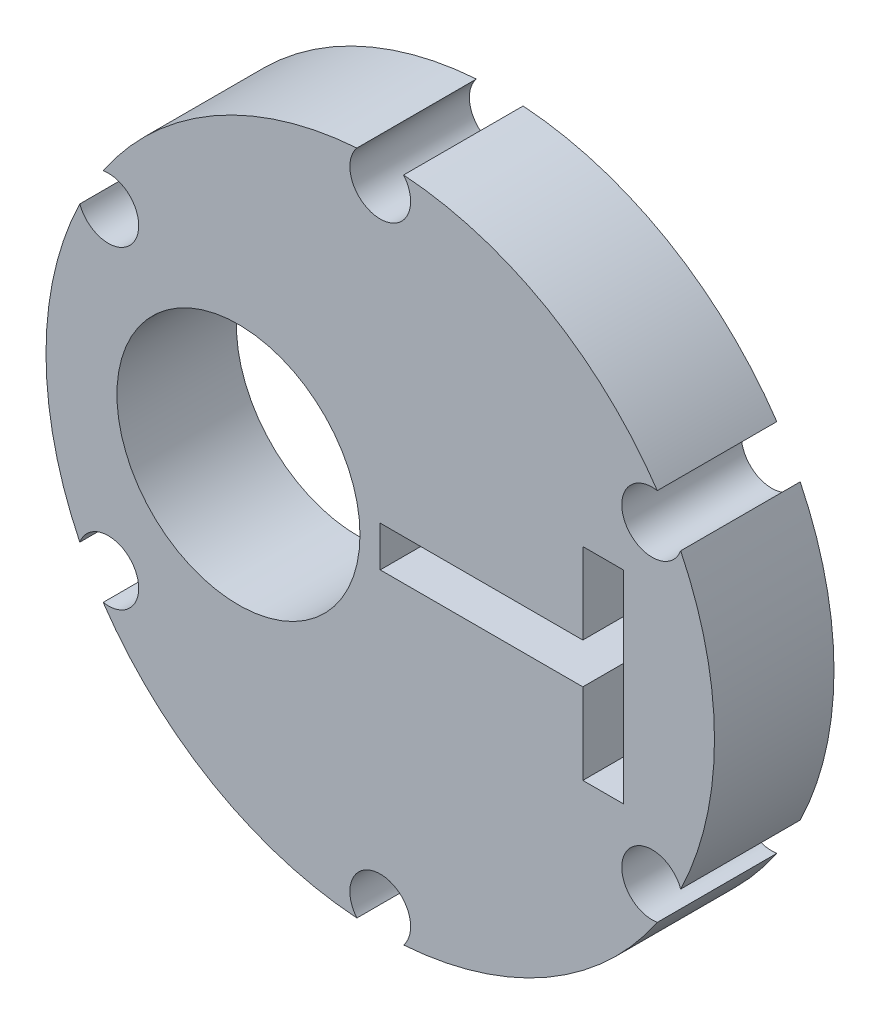
ISO-10303-21;
HEADER;
FILE_DESCRIPTION(('STEP AP214'),'2;1');
FILE_NAME('part.step','',(''),(''),'','','');
FILE_SCHEMA(('AUTOMOTIVE_DESIGN { 1 0 10303 214 1 1 1 1 }'));
ENDSEC;
DATA;
#1=APPLICATION_CONTEXT('core data for automotive mechanical design processes');
#2=APPLICATION_PROTOCOL_DEFINITION('international standard','automotive_design',2000,#1);
#3=PRODUCT_CONTEXT('',#1,'mechanical');
#4=PRODUCT('Part','Part','',(#3));
#5=PRODUCT_RELATED_PRODUCT_CATEGORY('part','',(#4));
#6=PRODUCT_DEFINITION_FORMATION('','',#4);
#7=PRODUCT_DEFINITION_CONTEXT('part definition',#1,'design');
#8=PRODUCT_DEFINITION('design','',#6,#7);
#9=PRODUCT_DEFINITION_SHAPE('','',#8);
#10=(LENGTH_UNIT() NAMED_UNIT(*) SI_UNIT(.MILLI.,.METRE.));
#11=(NAMED_UNIT(*) PLANE_ANGLE_UNIT() SI_UNIT($,.RADIAN.));
#12=(NAMED_UNIT(*) SI_UNIT($,.STERADIAN.) SOLID_ANGLE_UNIT());
#13=UNCERTAINTY_MEASURE_WITH_UNIT(LENGTH_MEASURE(1.E-05),#10,'distance_accuracy_value','');
#14=(GEOMETRIC_REPRESENTATION_CONTEXT(3) GLOBAL_UNCERTAINTY_ASSIGNED_CONTEXT((#13)) GLOBAL_UNIT_ASSIGNED_CONTEXT((#10,
#11,#12)) REPRESENTATION_CONTEXT('',''));
#15=CARTESIAN_POINT('',(0.,0.,0.));
#16=DIRECTION('',(0.,0.,1.));
#17=DIRECTION('',(1.,0.,0.));
#18=AXIS2_PLACEMENT_3D('',#15,#16,#17);
#19=CARTESIAN_POINT('',(0.,0.,5.9));
#20=DIRECTION('',(0.,0.,-1.));
#21=DIRECTION('',(-1.,0.,0.));
#22=AXIS2_PLACEMENT_3D('',#19,#20,#21);
#23=CYLINDRICAL_SURFACE('',#22,16.5);
#24=CARTESIAN_POINT('',(0.,0.,0.));
#25=DIRECTION('',(0.,0.,1.));
#26=DIRECTION('',(1.,0.,0.));
#27=AXIS2_PLACEMENT_3D('',#24,#25,#26);
#28=CIRCLE('',#27,16.5);
#29=CARTESIAN_POINT('',(14.8309142694271,-7.23145780136368,0.));
#30=VERTEX_POINT('',#29);
#31=CARTESIAN_POINT('',(14.8309142694271,7.23145780136372,0.));
#32=VERTEX_POINT('',#31);
#33=EDGE_CURVE('E329',#30,#32,#28,.T.);
#34=ORIENTED_EDGE('',*,*,#33,.T.);
#35=DIRECTION('',(0.,0.,1.));
#36=VECTOR('',#35,1.);
#37=CARTESIAN_POINT('',(14.8309142694271,7.23145780136372,2.95));
#38=LINE('',#37,#36);
#39=CARTESIAN_POINT('',(14.8309142694271,7.23145780136372,5.9));
#40=VERTEX_POINT('',#39);
#41=EDGE_CURVE('E286',#32,#40,#38,.T.);
#42=ORIENTED_EDGE('',*,*,#41,.T.);
#43=CARTESIAN_POINT('',(0.,0.,5.9));
#44=DIRECTION('',(0.,0.,1.));
#45=DIRECTION('',(1.,0.,0.));
#46=AXIS2_PLACEMENT_3D('',#43,#44,#45);
#47=CIRCLE('',#46,16.5);
#48=CARTESIAN_POINT('',(14.8309142694271,-7.23145780136368,5.9));
#49=VERTEX_POINT('',#48);
#50=EDGE_CURVE('E350',#49,#40,#47,.T.);
#51=ORIENTED_EDGE('',*,*,#50,.F.);
#52=DIRECTION('',(0.,0.,1.));
#53=VECTOR('',#52,1.);
#54=CARTESIAN_POINT('',(14.8309142694271,-7.23145780136368,2.95));
#55=LINE('',#54,#53);
#56=EDGE_CURVE('E277',#49,#30,#55,.F.);
#57=ORIENTED_EDGE('',*,*,#56,.T.);
#58=EDGE_LOOP('',(#34,#42,#51,#57));
#59=FACE_BOUND('',#58,.T.);
#60=ADVANCED_FACE('F32',(#59),#23,.T.);
#61=CARTESIAN_POINT('',(1.15283097233743,-16.4596774193548,0.));
#62=VERTEX_POINT('',#61);
#63=CARTESIAN_POINT('',(13.6780832970897,-9.22821961799116,0.));
#64=VERTEX_POINT('',#63);
#65=EDGE_CURVE('E326',#62,#64,#28,.T.);
#66=ORIENTED_EDGE('',*,*,#65,.T.);
#67=DIRECTION('',(0.,0.,1.));
#68=VECTOR('',#67,1.);
#69=CARTESIAN_POINT('',(13.6780832970897,-9.22821961799114,2.95));
#70=LINE('',#69,#68);
#71=CARTESIAN_POINT('',(13.6780832970897,-9.22821961799114,5.9));
#72=VERTEX_POINT('',#71);
#73=EDGE_CURVE('E280',#64,#72,#70,.T.);
#74=ORIENTED_EDGE('',*,*,#73,.T.);
#75=CARTESIAN_POINT('',(1.15283097233743,-16.4596774193548,5.9));
#76=VERTEX_POINT('',#75);
#77=EDGE_CURVE('E351',#76,#72,#47,.T.);
#78=ORIENTED_EDGE('',*,*,#77,.F.);
#79=DIRECTION('',(0.,0.,1.));
#80=VECTOR('',#79,1.);
#81=CARTESIAN_POINT('',(1.15283097233743,-16.4596774193548,2.95));
#82=LINE('',#81,#80);
#83=EDGE_CURVE('E271',#76,#62,#82,.F.);
#84=ORIENTED_EDGE('',*,*,#83,.T.);
#85=EDGE_LOOP('',(#66,#74,#78,#84));
#86=FACE_BOUND('',#85,.T.);
#87=ADVANCED_FACE('F374',(#86),#23,.T.);
#88=CARTESIAN_POINT('',(-13.6780832970896,-9.22821961799115,0.));
#89=VERTEX_POINT('',#88);
#90=CARTESIAN_POINT('',(-1.15283097233744,-16.4596774193548,0.));
#91=VERTEX_POINT('',#90);
#92=EDGE_CURVE('E320',#89,#91,#28,.T.);
#93=ORIENTED_EDGE('',*,*,#92,.T.);
#94=DIRECTION('',(0.,0.,1.));
#95=VECTOR('',#94,1.);
#96=CARTESIAN_POINT('',(-1.15283097233743,-16.4596774193548,2.95));
#97=LINE('',#96,#95);
#98=CARTESIAN_POINT('',(-1.15283097233743,-16.4596774193548,5.9));
#99=VERTEX_POINT('',#98);
#100=EDGE_CURVE('E274',#91,#99,#97,.T.);
#101=ORIENTED_EDGE('',*,*,#100,.T.);
#102=CARTESIAN_POINT('',(-13.6780832970896,-9.22821961799115,5.9));
#103=VERTEX_POINT('',#102);
#104=EDGE_CURVE('E355',#103,#99,#47,.T.);
#105=ORIENTED_EDGE('',*,*,#104,.F.);
#106=DIRECTION('',(0.,0.,1.));
#107=VECTOR('',#106,1.);
#108=CARTESIAN_POINT('',(-13.6780832970896,-9.22821961799115,2.95));
#109=LINE('',#108,#107);
#110=EDGE_CURVE('E265',#103,#89,#109,.F.);
#111=ORIENTED_EDGE('',*,*,#110,.T.);
#112=EDGE_LOOP('',(#93,#101,#105,#111));
#113=FACE_BOUND('',#112,.T.);
#114=ADVANCED_FACE('F378',(#113),#23,.T.);
#115=CARTESIAN_POINT('',(-14.8309142694271,7.23145780136367,0.));
#116=VERTEX_POINT('',#115);
#117=CARTESIAN_POINT('',(-14.8309142694271,-7.23145780136368,0.));
#118=VERTEX_POINT('',#117);
#119=EDGE_CURVE('E308',#116,#118,#28,.T.);
#120=ORIENTED_EDGE('',*,*,#119,.T.);
#121=DIRECTION('',(0.,0.,1.));
#122=VECTOR('',#121,1.);
#123=CARTESIAN_POINT('',(-14.8309142694271,-7.23145780136369,2.95));
#124=LINE('',#123,#122);
#125=CARTESIAN_POINT('',(-14.8309142694271,-7.23145780136369,5.9));
#126=VERTEX_POINT('',#125);
#127=EDGE_CURVE('E268',#118,#126,#124,.T.);
#128=ORIENTED_EDGE('',*,*,#127,.T.);
#129=CARTESIAN_POINT('',(-14.8309142694271,7.23145780136367,5.9));
#130=VERTEX_POINT('',#129);
#131=EDGE_CURVE('E303',#130,#126,#47,.T.);
#132=ORIENTED_EDGE('',*,*,#131,.F.);
#133=DIRECTION('',(0.,0.,1.));
#134=VECTOR('',#133,1.);
#135=CARTESIAN_POINT('',(-14.8309142694271,7.23145780136367,2.95));
#136=LINE('',#135,#134);
#137=EDGE_CURVE('E247',#130,#116,#136,.F.);
#138=ORIENTED_EDGE('',*,*,#137,.T.);
#139=EDGE_LOOP('',(#120,#128,#132,#138));
#140=FACE_BOUND('',#139,.T.);
#141=ADVANCED_FACE('F323',(#140),#23,.T.);
#142=CARTESIAN_POINT('',(-1.15283097233743,16.4596774193548,0.));
#143=VERTEX_POINT('',#142);
#144=CARTESIAN_POINT('',(-13.6780832970897,9.22821961799115,0.));
#145=VERTEX_POINT('',#144);
#146=EDGE_CURVE('E305',#143,#145,#28,.T.);
#147=ORIENTED_EDGE('',*,*,#146,.T.);
#148=DIRECTION('',(0.,0.,1.));
#149=VECTOR('',#148,1.);
#150=CARTESIAN_POINT('',(-13.6780832970897,9.22821961799113,2.95));
#151=LINE('',#150,#149);
#152=CARTESIAN_POINT('',(-13.6780832970897,9.22821961799113,5.9));
#153=VERTEX_POINT('',#152);
#154=EDGE_CURVE('E262',#145,#153,#151,.T.);
#155=ORIENTED_EDGE('',*,*,#154,.T.);
#156=CARTESIAN_POINT('',(-1.15283097233743,16.4596774193548,5.9));
#157=VERTEX_POINT('',#156);
#158=EDGE_CURVE('E299',#157,#153,#47,.T.);
#159=ORIENTED_EDGE('',*,*,#158,.F.);
#160=DIRECTION('',(0.,0.,1.));
#161=VECTOR('',#160,1.);
#162=CARTESIAN_POINT('',(-1.15283097233743,16.4596774193548,2.95));
#163=LINE('',#162,#161);
#164=EDGE_CURVE('E292',#157,#143,#163,.F.);
#165=ORIENTED_EDGE('',*,*,#164,.T.);
#166=EDGE_LOOP('',(#147,#155,#159,#165));
#167=FACE_BOUND('',#166,.T.);
#168=ADVANCED_FACE('F343',(#167),#23,.T.);
#169=CARTESIAN_POINT('',(13.6780832970897,9.22821961799114,5.9));
#170=VERTEX_POINT('',#169);
#171=CARTESIAN_POINT('',(1.15283097233743,16.4596774193548,5.9));
#172=VERTEX_POINT('',#171);
#173=EDGE_CURVE('E304',#170,#172,#47,.T.);
#174=ORIENTED_EDGE('',*,*,#173,.F.);
#175=DIRECTION('',(0.,0.,1.));
#176=VECTOR('',#175,1.);
#177=CARTESIAN_POINT('',(13.6780832970897,9.22821961799114,2.95));
#178=LINE('',#177,#176);
#179=CARTESIAN_POINT('',(13.6780832970897,9.22821961799114,0.));
#180=VERTEX_POINT('',#179);
#181=EDGE_CURVE('E283',#170,#180,#178,.F.);
#182=ORIENTED_EDGE('',*,*,#181,.T.);
#183=CARTESIAN_POINT('',(1.15283097233744,16.4596774193548,0.));
#184=VERTEX_POINT('',#183);
#185=EDGE_CURVE('E298',#180,#184,#28,.T.);
#186=ORIENTED_EDGE('',*,*,#185,.T.);
#187=DIRECTION('',(0.,0.,1.));
#188=VECTOR('',#187,1.);
#189=CARTESIAN_POINT('',(1.15283097233743,16.4596774193548,2.95));
#190=LINE('',#189,#188);
#191=EDGE_CURVE('E295',#184,#172,#190,.T.);
#192=ORIENTED_EDGE('',*,*,#191,.T.);
#193=EDGE_LOOP('',(#174,#182,#186,#192));
#194=FACE_BOUND('',#193,.T.);
#195=ADVANCED_FACE('F34',(#194),#23,.T.);
#196=CARTESIAN_POINT('',(0.,0.,5.9));
#197=DIRECTION('',(0.,0.,1.));
#198=DIRECTION('',(1.,0.,0.));
#199=AXIS2_PLACEMENT_3D('',#196,#197,#198);
#200=PLANE('',#199);
#201=DIRECTION('',(0.,1.,0.));
#202=VECTOR('',#201,1.);
#203=CARTESIAN_POINT('',(12.,5.,5.9));
#204=LINE('',#203,#202);
#205=CARTESIAN_POINT('',(12.,-5.,5.9));
#206=VERTEX_POINT('',#205);
#207=CARTESIAN_POINT('',(12.,5.,5.9));
#208=VERTEX_POINT('',#207);
#209=EDGE_CURVE('E47',#206,#208,#204,.T.);
#210=ORIENTED_EDGE('',*,*,#209,.F.);
#211=DIRECTION('',(1.,0.,0.));
#212=VECTOR('',#211,1.);
#213=CARTESIAN_POINT('',(12.,-5.,5.9));
#214=LINE('',#213,#212);
#215=CARTESIAN_POINT('',(10.,-5.,5.9));
#216=VERTEX_POINT('',#215);
#217=EDGE_CURVE('E188',#216,#206,#214,.T.);
#218=ORIENTED_EDGE('',*,*,#217,.F.);
#219=DIRECTION('',(0.,-1.,0.));
#220=VECTOR('',#219,1.);
#221=CARTESIAN_POINT('',(10.,-0.999999999999998,5.9));
#222=LINE('',#221,#220);
#223=CARTESIAN_POINT('',(10.,-0.999999999999998,5.9));
#224=VERTEX_POINT('',#223);
#225=EDGE_CURVE('E191',#224,#216,#222,.T.);
#226=ORIENTED_EDGE('',*,*,#225,.F.);
#227=DIRECTION('',(1.,0.,0.));
#228=VECTOR('',#227,1.);
#229=CARTESIAN_POINT('',(0.,-0.999999999999998,5.9));
#230=LINE('',#229,#228);
#231=CARTESIAN_POINT('',(0.,-0.999999999999998,5.9));
#232=VERTEX_POINT('',#231);
#233=EDGE_CURVE('E219',#232,#224,#230,.T.);
#234=ORIENTED_EDGE('',*,*,#233,.F.);
#235=DIRECTION('',(0.,-1.,0.));
#236=VECTOR('',#235,1.);
#237=CARTESIAN_POINT('',(0.,0.999999999999998,5.9));
#238=LINE('',#237,#236);
#239=CARTESIAN_POINT('',(0.,0.999999999999998,5.9));
#240=VERTEX_POINT('',#239);
#241=EDGE_CURVE('E216',#240,#232,#238,.T.);
#242=ORIENTED_EDGE('',*,*,#241,.F.);
#243=DIRECTION('',(-1.,0.,0.));
#244=VECTOR('',#243,1.);
#245=CARTESIAN_POINT('',(0.,0.999999999999998,5.9));
#246=LINE('',#245,#244);
#247=CARTESIAN_POINT('',(10.,0.999999999999998,5.9));
#248=VERTEX_POINT('',#247);
#249=EDGE_CURVE('E213',#248,#240,#246,.T.);
#250=ORIENTED_EDGE('',*,*,#249,.F.);
#251=DIRECTION('',(0.,-1.,0.));
#252=VECTOR('',#251,1.);
#253=CARTESIAN_POINT('',(10.,5.,5.9));
#254=LINE('',#253,#252);
#255=CARTESIAN_POINT('',(10.,5.,5.9));
#256=VERTEX_POINT('',#255);
#257=EDGE_CURVE('E210',#256,#248,#254,.T.);
#258=ORIENTED_EDGE('',*,*,#257,.F.);
#259=DIRECTION('',(-1.,0.,0.));
#260=VECTOR('',#259,1.);
#261=CARTESIAN_POINT('',(12.,5.,5.9));
#262=LINE('',#261,#260);
#263=EDGE_CURVE('E208',#208,#256,#262,.T.);
#264=ORIENTED_EDGE('',*,*,#263,.F.);
#265=EDGE_LOOP('',(#210,#218,#226,#234,#242,#250,#258,#264));
#266=FACE_BOUND('',#265,.T.);
#267=CARTESIAN_POINT('',(-7.,0.,5.9));
#268=DIRECTION('',(0.,0.,1.));
#269=DIRECTION('',(1.,0.,0.));
#270=AXIS2_PLACEMENT_3D('',#267,#268,#269);
#271=CIRCLE('',#270,6.);
#272=CARTESIAN_POINT('',(-0.999999999999999,0.,5.9));
#273=VERTEX_POINT('',#272);
#274=EDGE_CURVE('E226',#273,#273,#271,.T.);
#275=ORIENTED_EDGE('',*,*,#274,.F.);
#276=EDGE_LOOP('',(#275));
#277=FACE_BOUND('',#276,.T.);
#278=CARTESIAN_POINT('',(13.4233937586588,7.75,5.9));
#279=DIRECTION('',(0.,0.,1.));
#280=DIRECTION('',(1.,0.,0.));
#281=AXIS2_PLACEMENT_3D('',#278,#279,#280);
#282=CIRCLE('',#281,1.5);
#283=EDGE_CURVE('E248',#170,#40,#282,.T.);
#284=ORIENTED_EDGE('',*,*,#283,.F.);
#285=ORIENTED_EDGE('',*,*,#173,.T.);
#286=CARTESIAN_POINT('',(0.,15.5,5.9));
#287=DIRECTION('',(0.,0.,1.));
#288=DIRECTION('',(1.,0.,0.));
#289=AXIS2_PLACEMENT_3D('',#286,#287,#288);
#290=CIRCLE('',#289,1.5);
#291=EDGE_CURVE('E289',#157,#172,#290,.T.);
#292=ORIENTED_EDGE('',*,*,#291,.F.);
#293=ORIENTED_EDGE('',*,*,#158,.T.);
#294=CARTESIAN_POINT('',(-13.4233937586588,7.74999999999999,5.9));
#295=DIRECTION('',(0.,0.,1.));
#296=DIRECTION('',(1.,0.,0.));
#297=AXIS2_PLACEMENT_3D('',#294,#295,#296);
#298=CIRCLE('',#297,1.5);
#299=EDGE_CURVE('E241',#130,#153,#298,.T.);
#300=ORIENTED_EDGE('',*,*,#299,.F.);
#301=ORIENTED_EDGE('',*,*,#131,.T.);
#302=CARTESIAN_POINT('',(-13.4233937586588,-7.75000000000001,5.9));
#303=DIRECTION('',(0.,0.,1.));
#304=DIRECTION('',(1.,0.,0.));
#305=AXIS2_PLACEMENT_3D('',#302,#303,#304);
#306=CIRCLE('',#305,1.5);
#307=EDGE_CURVE('E257',#103,#126,#306,.T.);
#308=ORIENTED_EDGE('',*,*,#307,.F.);
#309=ORIENTED_EDGE('',*,*,#104,.T.);
#310=CARTESIAN_POINT('',(0.,-15.5,5.9));
#311=DIRECTION('',(0.,0.,1.));
#312=DIRECTION('',(1.,0.,0.));
#313=AXIS2_PLACEMENT_3D('',#310,#311,#312);
#314=CIRCLE('',#313,1.5);
#315=EDGE_CURVE('E255',#76,#99,#314,.T.);
#316=ORIENTED_EDGE('',*,*,#315,.F.);
#317=ORIENTED_EDGE('',*,*,#77,.T.);
#318=CARTESIAN_POINT('',(13.4233937586588,-7.75,5.9));
#319=DIRECTION('',(0.,0.,1.));
#320=DIRECTION('',(1.,0.,0.));
#321=AXIS2_PLACEMENT_3D('',#318,#319,#320);
#322=CIRCLE('',#321,1.5);
#323=EDGE_CURVE('E253',#49,#72,#322,.T.);
#324=ORIENTED_EDGE('',*,*,#323,.F.);
#325=ORIENTED_EDGE('',*,*,#50,.T.);
#326=EDGE_LOOP('',(#284,#285,#292,#293,#300,#301,#308,#309,#316,#317,#324,#325));
#327=FACE_BOUND('',#326,.T.);
#328=ADVANCED_FACE('F347',(#266,#277,#327),#200,.T.);
#329=CARTESIAN_POINT('',(0.,0.,0.));
#330=DIRECTION('',(0.,0.,1.));
#331=DIRECTION('',(1.,0.,0.));
#332=AXIS2_PLACEMENT_3D('',#329,#330,#331);
#333=PLANE('',#332);
#334=DIRECTION('',(1.,0.,0.));
#335=VECTOR('',#334,1.);
#336=CARTESIAN_POINT('',(12.,-5.,0.));
#337=LINE('',#336,#335);
#338=CARTESIAN_POINT('',(10.,-5.,0.));
#339=VERTEX_POINT('',#338);
#340=CARTESIAN_POINT('',(12.,-5.,0.));
#341=VERTEX_POINT('',#340);
#342=EDGE_CURVE('E177',#339,#341,#337,.T.);
#343=ORIENTED_EDGE('',*,*,#342,.T.);
#344=DIRECTION('',(0.,1.,0.));
#345=VECTOR('',#344,1.);
#346=CARTESIAN_POINT('',(12.,5.,0.));
#347=LINE('',#346,#345);
#348=CARTESIAN_POINT('',(12.,5.,0.));
#349=VERTEX_POINT('',#348);
#350=EDGE_CURVE('E171',#341,#349,#347,.T.);
#351=ORIENTED_EDGE('',*,*,#350,.T.);
#352=DIRECTION('',(-1.,0.,0.));
#353=VECTOR('',#352,1.);
#354=CARTESIAN_POINT('',(12.,5.,0.));
#355=LINE('',#354,#353);
#356=CARTESIAN_POINT('',(10.,5.,0.));
#357=VERTEX_POINT('',#356);
#358=EDGE_CURVE('E180',#349,#357,#355,.T.);
#359=ORIENTED_EDGE('',*,*,#358,.T.);
#360=DIRECTION('',(0.,-1.,0.));
#361=VECTOR('',#360,1.);
#362=CARTESIAN_POINT('',(10.,5.,0.));
#363=LINE('',#362,#361);
#364=CARTESIAN_POINT('',(10.,0.999999999999998,0.));
#365=VERTEX_POINT('',#364);
#366=EDGE_CURVE('E55',#357,#365,#363,.T.);
#367=ORIENTED_EDGE('',*,*,#366,.T.);
#368=DIRECTION('',(-1.,0.,0.));
#369=VECTOR('',#368,1.);
#370=CARTESIAN_POINT('',(0.,0.999999999999998,0.));
#371=LINE('',#370,#369);
#372=CARTESIAN_POINT('',(0.,0.999999999999998,0.));
#373=VERTEX_POINT('',#372);
#374=EDGE_CURVE('E195',#365,#373,#371,.T.);
#375=ORIENTED_EDGE('',*,*,#374,.T.);
#376=DIRECTION('',(0.,-1.,0.));
#377=VECTOR('',#376,1.);
#378=CARTESIAN_POINT('',(0.,0.999999999999998,0.));
#379=LINE('',#378,#377);
#380=CARTESIAN_POINT('',(0.,-0.999999999999998,0.));
#381=VERTEX_POINT('',#380);
#382=EDGE_CURVE('E198',#373,#381,#379,.T.);
#383=ORIENTED_EDGE('',*,*,#382,.T.);
#384=DIRECTION('',(1.,0.,0.));
#385=VECTOR('',#384,1.);
#386=CARTESIAN_POINT('',(0.,-0.999999999999998,0.));
#387=LINE('',#386,#385);
#388=CARTESIAN_POINT('',(10.,-0.999999999999998,0.));
#389=VERTEX_POINT('',#388);
#390=EDGE_CURVE('E201',#381,#389,#387,.T.);
#391=ORIENTED_EDGE('',*,*,#390,.T.);
#392=DIRECTION('',(0.,-1.,0.));
#393=VECTOR('',#392,1.);
#394=CARTESIAN_POINT('',(10.,-0.999999999999998,0.));
#395=LINE('',#394,#393);
#396=EDGE_CURVE('E204',#389,#339,#395,.T.);
#397=ORIENTED_EDGE('',*,*,#396,.T.);
#398=EDGE_LOOP('',(#343,#351,#359,#367,#375,#383,#391,#397));
#399=FACE_BOUND('',#398,.T.);
#400=CARTESIAN_POINT('',(-7.,0.,0.));
#401=DIRECTION('',(0.,0.,1.));
#402=DIRECTION('',(1.,0.,0.));
#403=AXIS2_PLACEMENT_3D('',#400,#401,#402);
#404=CIRCLE('',#403,6.);
#405=CARTESIAN_POINT('',(-0.999999999999999,0.,0.));
#406=VERTEX_POINT('',#405);
#407=EDGE_CURVE('E238',#406,#406,#404,.T.);
#408=ORIENTED_EDGE('',*,*,#407,.T.);
#409=EDGE_LOOP('',(#408));
#410=FACE_BOUND('',#409,.T.);
#411=ORIENTED_EDGE('',*,*,#185,.F.);
#412=CARTESIAN_POINT('',(13.4233937586588,7.75,0.));
#413=DIRECTION('',(0.,0.,1.));
#414=DIRECTION('',(1.,0.,0.));
#415=AXIS2_PLACEMENT_3D('',#412,#413,#414);
#416=CIRCLE('',#415,1.5);
#417=EDGE_CURVE('E244',#180,#32,#416,.T.);
#418=ORIENTED_EDGE('',*,*,#417,.T.);
#419=ORIENTED_EDGE('',*,*,#33,.F.);
#420=CARTESIAN_POINT('',(13.4233937586588,-7.75,0.));
#421=DIRECTION('',(0.,0.,1.));
#422=DIRECTION('',(1.,0.,0.));
#423=AXIS2_PLACEMENT_3D('',#420,#421,#422);
#424=CIRCLE('',#423,1.5);
#425=EDGE_CURVE('E250',#30,#64,#424,.T.);
#426=ORIENTED_EDGE('',*,*,#425,.T.);
#427=ORIENTED_EDGE('',*,*,#65,.F.);
#428=CARTESIAN_POINT('',(0.,-15.5,0.));
#429=DIRECTION('',(0.,0.,1.));
#430=DIRECTION('',(1.,0.,0.));
#431=AXIS2_PLACEMENT_3D('',#428,#429,#430);
#432=CIRCLE('',#431,1.5);
#433=EDGE_CURVE('E11',#62,#91,#432,.T.);
#434=ORIENTED_EDGE('',*,*,#433,.T.);
#435=ORIENTED_EDGE('',*,*,#92,.F.);
#436=CARTESIAN_POINT('',(-13.4233937586588,-7.75000000000001,0.));
#437=DIRECTION('',(0.,0.,1.));
#438=DIRECTION('',(1.,0.,0.));
#439=AXIS2_PLACEMENT_3D('',#436,#437,#438);
#440=CIRCLE('',#439,1.5);
#441=EDGE_CURVE('E40',#89,#118,#440,.T.);
#442=ORIENTED_EDGE('',*,*,#441,.T.);
#443=ORIENTED_EDGE('',*,*,#119,.F.);
#444=CARTESIAN_POINT('',(-13.4233937586588,7.74999999999999,0.));
#445=DIRECTION('',(0.,0.,1.));
#446=DIRECTION('',(1.,0.,0.));
#447=AXIS2_PLACEMENT_3D('',#444,#445,#446);
#448=CIRCLE('',#447,1.5);
#449=EDGE_CURVE('E311',#116,#145,#448,.T.);
#450=ORIENTED_EDGE('',*,*,#449,.T.);
#451=ORIENTED_EDGE('',*,*,#146,.F.);
#452=CARTESIAN_POINT('',(0.,15.5,0.));
#453=DIRECTION('',(0.,0.,1.));
#454=DIRECTION('',(1.,0.,0.));
#455=AXIS2_PLACEMENT_3D('',#452,#453,#454);
#456=CIRCLE('',#455,1.5);
#457=EDGE_CURVE('E302',#143,#184,#456,.T.);
#458=ORIENTED_EDGE('',*,*,#457,.T.);
#459=EDGE_LOOP('',(#411,#418,#419,#426,#427,#434,#435,#442,#443,#450,#451,#458));
#460=FACE_BOUND('',#459,.T.);
#461=ADVANCED_FACE('F184',(#399,#410,#460),#333,.F.);
#462=CARTESIAN_POINT('',(0.,15.5,0.));
#463=DIRECTION('',(0.,0.,1.));
#464=DIRECTION('',(1.,0.,0.));
#465=AXIS2_PLACEMENT_3D('',#462,#463,#464);
#466=CYLINDRICAL_SURFACE('',#465,1.5);
#467=ORIENTED_EDGE('',*,*,#457,.F.);
#468=ORIENTED_EDGE('',*,*,#164,.F.);
#469=ORIENTED_EDGE('',*,*,#291,.T.);
#470=ORIENTED_EDGE('',*,*,#191,.F.);
#471=EDGE_LOOP('',(#467,#468,#469,#470));
#472=FACE_BOUND('',#471,.T.);
#473=ADVANCED_FACE('F339',(#472),#466,.F.);
#474=CARTESIAN_POINT('',(-13.4233937586588,7.74999999999999,0.));
#475=DIRECTION('',(0.,0.,1.));
#476=DIRECTION('',(1.,0.,0.));
#477=AXIS2_PLACEMENT_3D('',#474,#475,#476);
#478=CYLINDRICAL_SURFACE('',#477,1.5);
#479=ORIENTED_EDGE('',*,*,#449,.F.);
#480=ORIENTED_EDGE('',*,*,#137,.F.);
#481=ORIENTED_EDGE('',*,*,#299,.T.);
#482=ORIENTED_EDGE('',*,*,#154,.F.);
#483=EDGE_LOOP('',(#479,#480,#481,#482));
#484=FACE_BOUND('',#483,.T.);
#485=ADVANCED_FACE('F362',(#484),#478,.F.);
#486=CARTESIAN_POINT('',(-13.4233937586588,-7.75000000000001,0.));
#487=DIRECTION('',(0.,0.,1.));
#488=DIRECTION('',(1.,0.,0.));
#489=AXIS2_PLACEMENT_3D('',#486,#487,#488);
#490=CYLINDRICAL_SURFACE('',#489,1.5);
#491=ORIENTED_EDGE('',*,*,#441,.F.);
#492=ORIENTED_EDGE('',*,*,#110,.F.);
#493=ORIENTED_EDGE('',*,*,#307,.T.);
#494=ORIENTED_EDGE('',*,*,#127,.F.);
#495=EDGE_LOOP('',(#491,#492,#493,#494));
#496=FACE_BOUND('',#495,.T.);
#497=ADVANCED_FACE('F364',(#496),#490,.F.);
#498=CARTESIAN_POINT('',(0.,-15.5,0.));
#499=DIRECTION('',(0.,0.,1.));
#500=DIRECTION('',(1.,0.,0.));
#501=AXIS2_PLACEMENT_3D('',#498,#499,#500);
#502=CYLINDRICAL_SURFACE('',#501,1.5);
#503=ORIENTED_EDGE('',*,*,#433,.F.);
#504=ORIENTED_EDGE('',*,*,#83,.F.);
#505=ORIENTED_EDGE('',*,*,#315,.T.);
#506=ORIENTED_EDGE('',*,*,#100,.F.);
#507=EDGE_LOOP('',(#503,#504,#505,#506));
#508=FACE_BOUND('',#507,.T.);
#509=ADVANCED_FACE('F370',(#508),#502,.F.);
#510=CARTESIAN_POINT('',(13.4233937586588,-7.75,0.));
#511=DIRECTION('',(0.,0.,1.));
#512=DIRECTION('',(1.,0.,0.));
#513=AXIS2_PLACEMENT_3D('',#510,#511,#512);
#514=CYLINDRICAL_SURFACE('',#513,1.5);
#515=ORIENTED_EDGE('',*,*,#425,.F.);
#516=ORIENTED_EDGE('',*,*,#56,.F.);
#517=ORIENTED_EDGE('',*,*,#323,.T.);
#518=ORIENTED_EDGE('',*,*,#73,.F.);
#519=EDGE_LOOP('',(#515,#516,#517,#518));
#520=FACE_BOUND('',#519,.T.);
#521=ADVANCED_FACE('F426',(#520),#514,.F.);
#522=CARTESIAN_POINT('',(13.4233937586588,7.75,0.));
#523=DIRECTION('',(0.,0.,1.));
#524=DIRECTION('',(1.,0.,0.));
#525=AXIS2_PLACEMENT_3D('',#522,#523,#524);
#526=CYLINDRICAL_SURFACE('',#525,1.5);
#527=ORIENTED_EDGE('',*,*,#417,.F.);
#528=ORIENTED_EDGE('',*,*,#181,.F.);
#529=ORIENTED_EDGE('',*,*,#283,.T.);
#530=ORIENTED_EDGE('',*,*,#41,.F.);
#531=EDGE_LOOP('',(#527,#528,#529,#530));
#532=FACE_BOUND('',#531,.T.);
#533=ADVANCED_FACE('F435',(#532),#526,.F.);
#534=CARTESIAN_POINT('',(-7.,0.,0.));
#535=DIRECTION('',(0.,0.,1.));
#536=DIRECTION('',(1.,0.,0.));
#537=AXIS2_PLACEMENT_3D('',#534,#535,#536);
#538=CYLINDRICAL_SURFACE('',#537,6.);
#539=ORIENTED_EDGE('',*,*,#407,.F.);
#540=EDGE_LOOP('',(#539));
#541=FACE_BOUND('',#540,.T.);
#542=ORIENTED_EDGE('',*,*,#274,.T.);
#543=EDGE_LOOP('',(#542));
#544=FACE_BOUND('',#543,.T.);
#545=ADVANCED_FACE('F444',(#541,#544),#538,.F.);
#546=CARTESIAN_POINT('',(12.,5.,0.));
#547=DIRECTION('',(1.,0.,0.));
#548=DIRECTION('',(0.,0.,-1.));
#549=AXIS2_PLACEMENT_3D('',#546,#547,#548);
#550=PLANE('',#549);
#551=ORIENTED_EDGE('',*,*,#209,.T.);
#552=DIRECTION('',(0.,0.,1.));
#553=VECTOR('',#552,1.);
#554=CARTESIAN_POINT('',(12.,5.,0.));
#555=LINE('',#554,#553);
#556=EDGE_CURVE('E167',#349,#208,#555,.T.);
#557=ORIENTED_EDGE('',*,*,#556,.F.);
#558=ORIENTED_EDGE('',*,*,#350,.F.);
#559=DIRECTION('',(0.,0.,1.));
#560=VECTOR('',#559,1.);
#561=CARTESIAN_POINT('',(12.,-5.,0.));
#562=LINE('',#561,#560);
#563=EDGE_CURVE('E224',#341,#206,#562,.T.);
#564=ORIENTED_EDGE('',*,*,#563,.T.);
#565=EDGE_LOOP('',(#551,#557,#558,#564));
#566=FACE_BOUND('',#565,.T.);
#567=ADVANCED_FACE('F169',(#566),#550,.F.);
#568=CARTESIAN_POINT('',(12.,-5.,0.));
#569=DIRECTION('',(0.,-1.,0.));
#570=DIRECTION('',(0.,0.,-1.));
#571=AXIS2_PLACEMENT_3D('',#568,#569,#570);
#572=PLANE('',#571);
#573=ORIENTED_EDGE('',*,*,#217,.T.);
#574=ORIENTED_EDGE('',*,*,#563,.F.);
#575=ORIENTED_EDGE('',*,*,#342,.F.);
#576=DIRECTION('',(0.,0.,1.));
#577=VECTOR('',#576,1.);
#578=CARTESIAN_POINT('',(10.,-5.,0.));
#579=LINE('',#578,#577);
#580=EDGE_CURVE('E227',#339,#216,#579,.T.);
#581=ORIENTED_EDGE('',*,*,#580,.T.);
#582=EDGE_LOOP('',(#573,#574,#575,#581));
#583=FACE_BOUND('',#582,.T.);
#584=ADVANCED_FACE('F462',(#583),#572,.F.);
#585=CARTESIAN_POINT('',(10.,-0.999999999999998,0.));
#586=DIRECTION('',(-1.,0.,0.));
#587=DIRECTION('',(0.,-1.,0.));
#588=AXIS2_PLACEMENT_3D('',#585,#586,#587);
#589=PLANE('',#588);
#590=ORIENTED_EDGE('',*,*,#225,.T.);
#591=ORIENTED_EDGE('',*,*,#580,.F.);
#592=ORIENTED_EDGE('',*,*,#396,.F.);
#593=DIRECTION('',(0.,0.,1.));
#594=VECTOR('',#593,1.);
#595=CARTESIAN_POINT('',(10.,-0.999999999999998,0.));
#596=LINE('',#595,#594);
#597=EDGE_CURVE('E229',#389,#224,#596,.T.);
#598=ORIENTED_EDGE('',*,*,#597,.T.);
#599=EDGE_LOOP('',(#590,#591,#592,#598));
#600=FACE_BOUND('',#599,.T.);
#601=ADVANCED_FACE('F471',(#600),#589,.F.);
#602=CARTESIAN_POINT('',(0.,-0.999999999999998,0.));
#603=DIRECTION('',(0.,-1.,0.));
#604=DIRECTION('',(0.,0.,-1.));
#605=AXIS2_PLACEMENT_3D('',#602,#603,#604);
#606=PLANE('',#605);
#607=ORIENTED_EDGE('',*,*,#233,.T.);
#608=ORIENTED_EDGE('',*,*,#597,.F.);
#609=ORIENTED_EDGE('',*,*,#390,.F.);
#610=DIRECTION('',(0.,0.,1.));
#611=VECTOR('',#610,1.);
#612=CARTESIAN_POINT('',(0.,-0.999999999999998,0.));
#613=LINE('',#612,#611);
#614=EDGE_CURVE('E231',#381,#232,#613,.T.);
#615=ORIENTED_EDGE('',*,*,#614,.T.);
#616=EDGE_LOOP('',(#607,#608,#609,#615));
#617=FACE_BOUND('',#616,.T.);
#618=ADVANCED_FACE('F480',(#617),#606,.F.);
#619=CARTESIAN_POINT('',(0.,0.999999999999998,0.));
#620=DIRECTION('',(-1.,0.,0.));
#621=DIRECTION('',(0.,-1.,0.));
#622=AXIS2_PLACEMENT_3D('',#619,#620,#621);
#623=PLANE('',#622);
#624=ORIENTED_EDGE('',*,*,#241,.T.);
#625=ORIENTED_EDGE('',*,*,#614,.F.);
#626=ORIENTED_EDGE('',*,*,#382,.F.);
#627=DIRECTION('',(0.,0.,1.));
#628=VECTOR('',#627,1.);
#629=CARTESIAN_POINT('',(0.,0.999999999999998,0.));
#630=LINE('',#629,#628);
#631=EDGE_CURVE('E233',#373,#240,#630,.T.);
#632=ORIENTED_EDGE('',*,*,#631,.T.);
#633=EDGE_LOOP('',(#624,#625,#626,#632));
#634=FACE_BOUND('',#633,.T.);
#635=ADVANCED_FACE('F489',(#634),#623,.F.);
#636=CARTESIAN_POINT('',(0.,0.999999999999998,0.));
#637=DIRECTION('',(0.,1.,0.));
#638=DIRECTION('',(0.,0.,1.));
#639=AXIS2_PLACEMENT_3D('',#636,#637,#638);
#640=PLANE('',#639);
#641=ORIENTED_EDGE('',*,*,#249,.T.);
#642=ORIENTED_EDGE('',*,*,#631,.F.);
#643=ORIENTED_EDGE('',*,*,#374,.F.);
#644=DIRECTION('',(0.,0.,1.));
#645=VECTOR('',#644,1.);
#646=CARTESIAN_POINT('',(10.,0.999999999999998,0.));
#647=LINE('',#646,#645);
#648=EDGE_CURVE('E235',#365,#248,#647,.T.);
#649=ORIENTED_EDGE('',*,*,#648,.T.);
#650=EDGE_LOOP('',(#641,#642,#643,#649));
#651=FACE_BOUND('',#650,.T.);
#652=ADVANCED_FACE('F498',(#651),#640,.F.);
#653=CARTESIAN_POINT('',(10.,5.,0.));
#654=DIRECTION('',(-1.,0.,0.));
#655=DIRECTION('',(0.,-1.,0.));
#656=AXIS2_PLACEMENT_3D('',#653,#654,#655);
#657=PLANE('',#656);
#658=ORIENTED_EDGE('',*,*,#257,.T.);
#659=ORIENTED_EDGE('',*,*,#648,.F.);
#660=ORIENTED_EDGE('',*,*,#366,.F.);
#661=DIRECTION('',(0.,0.,1.));
#662=VECTOR('',#661,1.);
#663=CARTESIAN_POINT('',(10.,5.,0.));
#664=LINE('',#663,#662);
#665=EDGE_CURVE('E176',#357,#256,#664,.T.);
#666=ORIENTED_EDGE('',*,*,#665,.T.);
#667=EDGE_LOOP('',(#658,#659,#660,#666));
#668=FACE_BOUND('',#667,.T.);
#669=ADVANCED_FACE('F507',(#668),#657,.F.);
#670=CARTESIAN_POINT('',(12.,5.,0.));
#671=DIRECTION('',(0.,1.,0.));
#672=DIRECTION('',(0.,0.,1.));
#673=AXIS2_PLACEMENT_3D('',#670,#671,#672);
#674=PLANE('',#673);
#675=ORIENTED_EDGE('',*,*,#263,.T.);
#676=ORIENTED_EDGE('',*,*,#665,.F.);
#677=ORIENTED_EDGE('',*,*,#358,.F.);
#678=ORIENTED_EDGE('',*,*,#556,.T.);
#679=EDGE_LOOP('',(#675,#676,#677,#678));
#680=FACE_BOUND('',#679,.T.);
#681=ADVANCED_FACE('F181',(#680),#674,.F.);
#682=CLOSED_SHELL('',(#60,#87,#114,#141,#168,#195,#328,#461,#473,#485,#497,#509,#521,#533,#545,
#567,#584,#601,#618,#635,#652,#669,#681));
#683=MANIFOLD_SOLID_BREP('B2',#682);
#684=ADVANCED_BREP_SHAPE_REPRESENTATION('',(#18,#683),#14);
#685=SHAPE_DEFINITION_REPRESENTATION(#9,#684);
ENDSEC;
END-ISO-10303-21;
